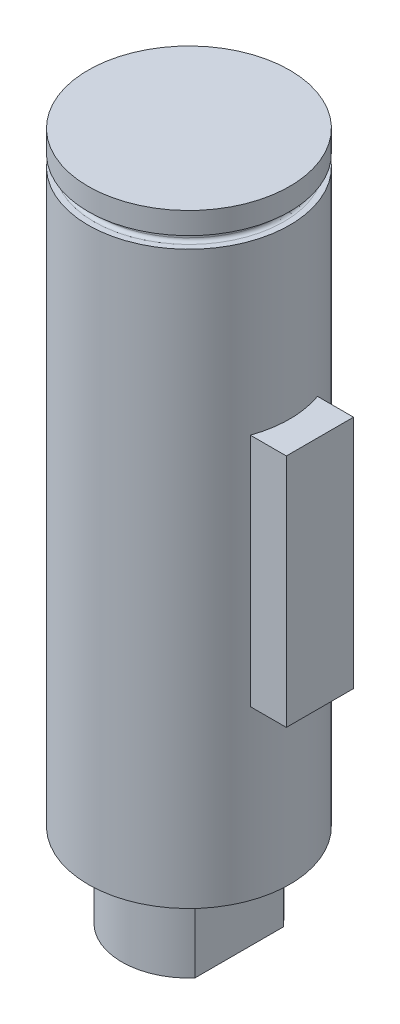
ISO-10303-21;
HEADER;
FILE_DESCRIPTION(('STEP AP214'),'2;1');
FILE_NAME('part.step','',(''),(''),'','','');
FILE_SCHEMA(('AUTOMOTIVE_DESIGN { 1 0 10303 214 1 1 1 1 }'));
ENDSEC;
DATA;
#1=APPLICATION_CONTEXT('core data for automotive mechanical design processes');
#2=APPLICATION_PROTOCOL_DEFINITION('international standard','automotive_design',2000,#1);
#3=PRODUCT_CONTEXT('',#1,'mechanical');
#4=PRODUCT('Part','Part','',(#3));
#5=PRODUCT_RELATED_PRODUCT_CATEGORY('part','',(#4));
#6=PRODUCT_DEFINITION_FORMATION('','',#4);
#7=PRODUCT_DEFINITION_CONTEXT('part definition',#1,'design');
#8=PRODUCT_DEFINITION('design','',#6,#7);
#9=PRODUCT_DEFINITION_SHAPE('','',#8);
#10=(LENGTH_UNIT() NAMED_UNIT(*) SI_UNIT(.MILLI.,.METRE.));
#11=(NAMED_UNIT(*) PLANE_ANGLE_UNIT() SI_UNIT($,.RADIAN.));
#12=(NAMED_UNIT(*) SI_UNIT($,.STERADIAN.) SOLID_ANGLE_UNIT());
#13=UNCERTAINTY_MEASURE_WITH_UNIT(LENGTH_MEASURE(1.E-05),#10,'distance_accuracy_value','');
#14=(GEOMETRIC_REPRESENTATION_CONTEXT(3) GLOBAL_UNCERTAINTY_ASSIGNED_CONTEXT((#13)) GLOBAL_UNIT_ASSIGNED_CONTEXT((#10,
#11,#12)) REPRESENTATION_CONTEXT('',''));
#15=CARTESIAN_POINT('',(0.,0.,0.));
#16=DIRECTION('',(0.,0.,1.));
#17=DIRECTION('',(1.,0.,0.));
#18=AXIS2_PLACEMENT_3D('',#15,#16,#17);
#19=CARTESIAN_POINT('',(0.,-10.,0.));
#20=DIRECTION('',(0.,-1.,0.));
#21=DIRECTION('',(0.,0.,-1.));
#22=AXIS2_PLACEMENT_3D('',#19,#20,#21);
#23=PLANE('',#22);
#24=CARTESIAN_POINT('',(0.,-10.,0.));
#25=DIRECTION('',(0.,-1.,0.));
#26=DIRECTION('',(0.,0.,-1.));
#27=AXIS2_PLACEMENT_3D('',#24,#25,#26);
#28=CIRCLE('',#27,6.);
#29=CARTESIAN_POINT('',(0.,-10.,-6.));
#30=VERTEX_POINT('',#29);
#31=EDGE_CURVE('E139',#30,#30,#28,.T.);
#32=ORIENTED_EDGE('',*,*,#31,.T.);
#33=EDGE_LOOP('',(#32));
#34=FACE_BOUND('',#33,.T.);
#35=DIRECTION('',(0.,0.,1.));
#36=VECTOR('',#35,1.);
#37=CARTESIAN_POINT('',(3.,-10.,-2.64575131106459));
#38=LINE('',#37,#36);
#39=CARTESIAN_POINT('',(3.,-10.,-2.64575131106459));
#40=VERTEX_POINT('',#39);
#41=CARTESIAN_POINT('',(3.,-10.,2.64575131106459));
#42=VERTEX_POINT('',#41);
#43=EDGE_CURVE('E115',#40,#42,#38,.T.);
#44=ORIENTED_EDGE('',*,*,#43,.F.);
#45=CARTESIAN_POINT('',(0.,-10.,0.));
#46=DIRECTION('',(0.,-1.,0.));
#47=DIRECTION('',(0.,0.,-1.));
#48=AXIS2_PLACEMENT_3D('',#45,#46,#47);
#49=CIRCLE('',#48,4.);
#50=EDGE_CURVE('E54',#42,#40,#49,.T.);
#51=ORIENTED_EDGE('',*,*,#50,.F.);
#52=EDGE_LOOP('',(#44,#51));
#53=FACE_BOUND('',#52,.T.);
#54=ADVANCED_FACE('F37',(#34,#53),#23,.T.);
#55=CARTESIAN_POINT('',(0.,14.,0.));
#56=DIRECTION('',(0.,-1.,0.));
#57=DIRECTION('',(0.,0.,-1.));
#58=AXIS2_PLACEMENT_3D('',#55,#56,#57);
#59=CYLINDRICAL_SURFACE('',#58,6.);
#60=ORIENTED_EDGE('',*,*,#31,.F.);
#61=EDGE_LOOP('',(#60));
#62=FACE_BOUND('',#61,.T.);
#63=DIRECTION('',(0.,-1.,0.));
#64=VECTOR('',#63,1.);
#65=CARTESIAN_POINT('',(5.65685424949238,14.,-2.));
#66=LINE('',#65,#64);
#67=CARTESIAN_POINT('',(5.65685424949238,14.,-2.));
#68=VERTEX_POINT('',#67);
#69=CARTESIAN_POINT('',(5.65685424949238,0.,-2.));
#70=VERTEX_POINT('',#69);
#71=EDGE_CURVE('E155',#68,#70,#66,.T.);
#72=ORIENTED_EDGE('',*,*,#71,.T.);
#73=CARTESIAN_POINT('',(0.,0.,0.));
#74=DIRECTION('',(0.,-1.,0.));
#75=DIRECTION('',(0.,0.,-1.));
#76=AXIS2_PLACEMENT_3D('',#73,#74,#75);
#77=CIRCLE('',#76,6.);
#78=CARTESIAN_POINT('',(5.65685424949238,0.,2.));
#79=VERTEX_POINT('',#78);
#80=EDGE_CURVE('E138',#70,#79,#77,.T.);
#81=ORIENTED_EDGE('',*,*,#80,.T.);
#82=DIRECTION('',(0.,-1.,0.));
#83=VECTOR('',#82,1.);
#84=CARTESIAN_POINT('',(5.65685424949238,14.,2.));
#85=LINE('',#84,#83);
#86=CARTESIAN_POINT('',(5.65685424949238,14.,2.));
#87=VERTEX_POINT('',#86);
#88=EDGE_CURVE('E11',#87,#79,#85,.T.);
#89=ORIENTED_EDGE('',*,*,#88,.F.);
#90=CARTESIAN_POINT('',(0.,14.,0.));
#91=DIRECTION('',(0.,1.,0.));
#92=DIRECTION('',(0.,0.,1.));
#93=AXIS2_PLACEMENT_3D('',#90,#91,#92);
#94=CIRCLE('',#93,6.);
#95=EDGE_CURVE('E142',#87,#68,#94,.T.);
#96=ORIENTED_EDGE('',*,*,#95,.T.);
#97=EDGE_LOOP('',(#72,#81,#89,#96));
#98=FACE_BOUND('',#97,.T.);
#99=CARTESIAN_POINT('',(0.,24.,0.));
#100=DIRECTION('',(0.,1.,0.));
#101=DIRECTION('',(0.,0.,1.));
#102=AXIS2_PLACEMENT_3D('',#99,#100,#101);
#103=CIRCLE('',#102,6.);
#104=CARTESIAN_POINT('',(0.,24.,6.));
#105=VERTEX_POINT('',#104);
#106=EDGE_CURVE('E134',#105,#105,#103,.T.);
#107=ORIENTED_EDGE('',*,*,#106,.F.);
#108=EDGE_LOOP('',(#107));
#109=FACE_BOUND('',#108,.T.);
#110=ADVANCED_FACE('F175',(#62,#98,#109),#59,.T.);
#111=CARTESIAN_POINT('',(0.,0.,0.));
#112=DIRECTION('',(0.,1.,0.));
#113=DIRECTION('',(0.,0.,1.));
#114=AXIS2_PLACEMENT_3D('',#111,#112,#113);
#115=PLANE('',#114);
#116=ORIENTED_EDGE('',*,*,#80,.F.);
#117=DIRECTION('',(-1.,0.,0.));
#118=VECTOR('',#117,1.);
#119=CARTESIAN_POINT('',(7.8,0.,-2.));
#120=LINE('',#119,#118);
#121=CARTESIAN_POINT('',(7.8,0.,-2.));
#122=VERTEX_POINT('',#121);
#123=EDGE_CURVE('E152',#122,#70,#120,.T.);
#124=ORIENTED_EDGE('',*,*,#123,.F.);
#125=DIRECTION('',(0.,0.,-1.));
#126=VECTOR('',#125,1.);
#127=CARTESIAN_POINT('',(7.8,0.,2.));
#128=LINE('',#127,#126);
#129=CARTESIAN_POINT('',(7.8,0.,2.));
#130=VERTEX_POINT('',#129);
#131=EDGE_CURVE('E81',#130,#122,#128,.T.);
#132=ORIENTED_EDGE('',*,*,#131,.F.);
#133=DIRECTION('',(1.,0.,0.));
#134=VECTOR('',#133,1.);
#135=CARTESIAN_POINT('',(7.8,0.,2.));
#136=LINE('',#135,#134);
#137=EDGE_CURVE('E147',#79,#130,#136,.T.);
#138=ORIENTED_EDGE('',*,*,#137,.F.);
#139=EDGE_LOOP('',(#116,#124,#132,#138));
#140=FACE_BOUND('',#139,.T.);
#141=ADVANCED_FACE('F186',(#140),#115,.F.);
#142=CARTESIAN_POINT('',(7.8,14.,2.));
#143=DIRECTION('',(0.,0.,-1.));
#144=DIRECTION('',(-1.,0.,0.));
#145=AXIS2_PLACEMENT_3D('',#142,#143,#144);
#146=PLANE('',#145);
#147=ORIENTED_EDGE('',*,*,#137,.T.);
#148=DIRECTION('',(0.,-1.,0.));
#149=VECTOR('',#148,1.);
#150=CARTESIAN_POINT('',(7.8,14.,2.));
#151=LINE('',#150,#149);
#152=CARTESIAN_POINT('',(7.8,14.,2.));
#153=VERTEX_POINT('',#152);
#154=EDGE_CURVE('E46',#153,#130,#151,.T.);
#155=ORIENTED_EDGE('',*,*,#154,.F.);
#156=DIRECTION('',(1.,0.,0.));
#157=VECTOR('',#156,1.);
#158=CARTESIAN_POINT('',(7.8,14.,2.));
#159=LINE('',#158,#157);
#160=EDGE_CURVE('E85',#87,#153,#159,.T.);
#161=ORIENTED_EDGE('',*,*,#160,.F.);
#162=ORIENTED_EDGE('',*,*,#88,.T.);
#163=EDGE_LOOP('',(#147,#155,#161,#162));
#164=FACE_BOUND('',#163,.T.);
#165=ADVANCED_FACE('F204',(#164),#146,.F.);
#166=CARTESIAN_POINT('',(7.8,14.,2.));
#167=DIRECTION('',(-1.,0.,0.));
#168=DIRECTION('',(0.,0.,1.));
#169=AXIS2_PLACEMENT_3D('',#166,#167,#168);
#170=PLANE('',#169);
#171=ORIENTED_EDGE('',*,*,#131,.T.);
#172=DIRECTION('',(0.,-1.,0.));
#173=VECTOR('',#172,1.);
#174=CARTESIAN_POINT('',(7.8,14.,-2.));
#175=LINE('',#174,#173);
#176=CARTESIAN_POINT('',(7.8,14.,-2.));
#177=VERTEX_POINT('',#176);
#178=EDGE_CURVE('E162',#177,#122,#175,.T.);
#179=ORIENTED_EDGE('',*,*,#178,.F.);
#180=DIRECTION('',(0.,0.,-1.));
#181=VECTOR('',#180,1.);
#182=CARTESIAN_POINT('',(7.8,14.,2.));
#183=LINE('',#182,#181);
#184=EDGE_CURVE('E151',#153,#177,#183,.T.);
#185=ORIENTED_EDGE('',*,*,#184,.F.);
#186=ORIENTED_EDGE('',*,*,#154,.T.);
#187=EDGE_LOOP('',(#171,#179,#185,#186));
#188=FACE_BOUND('',#187,.T.);
#189=ADVANCED_FACE('F208',(#188),#170,.F.);
#190=CARTESIAN_POINT('',(7.8,14.,-2.));
#191=DIRECTION('',(0.,0.,1.));
#192=DIRECTION('',(1.,0.,0.));
#193=AXIS2_PLACEMENT_3D('',#190,#191,#192);
#194=PLANE('',#193);
#195=ORIENTED_EDGE('',*,*,#123,.T.);
#196=ORIENTED_EDGE('',*,*,#71,.F.);
#197=DIRECTION('',(-1.,0.,0.));
#198=VECTOR('',#197,1.);
#199=CARTESIAN_POINT('',(7.8,14.,-2.));
#200=LINE('',#199,#198);
#201=EDGE_CURVE('E63',#177,#68,#200,.T.);
#202=ORIENTED_EDGE('',*,*,#201,.F.);
#203=ORIENTED_EDGE('',*,*,#178,.T.);
#204=EDGE_LOOP('',(#195,#196,#202,#203));
#205=FACE_BOUND('',#204,.T.);
#206=ADVANCED_FACE('F201',(#205),#194,.F.);
#207=CARTESIAN_POINT('',(0.,14.,0.));
#208=DIRECTION('',(0.,1.,0.));
#209=DIRECTION('',(0.,0.,1.));
#210=AXIS2_PLACEMENT_3D('',#207,#208,#209);
#211=PLANE('',#210);
#212=ORIENTED_EDGE('',*,*,#95,.F.);
#213=ORIENTED_EDGE('',*,*,#160,.T.);
#214=ORIENTED_EDGE('',*,*,#184,.T.);
#215=ORIENTED_EDGE('',*,*,#201,.T.);
#216=EDGE_LOOP('',(#212,#213,#214,#215));
#217=FACE_BOUND('',#216,.T.);
#218=ADVANCED_FACE('F198',(#217),#211,.T.);
#219=CARTESIAN_POINT('',(-5.5030110244233,24.7,-1.28037871939337));
#220=DIRECTION('',(0.,-1.,0.));
#221=DIRECTION('',(0.,0.,-1.));
#222=AXIS2_PLACEMENT_3D('',#219,#220,#221);
#223=PLANE('',#222);
#224=CARTESIAN_POINT('',(0.,24.7,0.));
#225=DIRECTION('',(0.,-1.,0.));
#226=DIRECTION('',(0.,0.,-1.));
#227=AXIS2_PLACEMENT_3D('',#224,#225,#226);
#228=CIRCLE('',#227,5.64999999999998);
#229=CARTESIAN_POINT('',(0.,24.7,-5.64999999999998));
#230=VERTEX_POINT('',#229);
#231=EDGE_CURVE('E131',#230,#230,#228,.T.);
#232=ORIENTED_EDGE('',*,*,#231,.F.);
#233=EDGE_LOOP('',(#232));
#234=FACE_BOUND('',#233,.T.);
#235=CARTESIAN_POINT('',(0.,24.7,0.));
#236=DIRECTION('',(0.,-1.,0.));
#237=DIRECTION('',(0.,0.,-1.));
#238=AXIS2_PLACEMENT_3D('',#235,#236,#237);
#239=CIRCLE('',#238,6.);
#240=CARTESIAN_POINT('',(0.,24.7,-6.));
#241=VERTEX_POINT('',#240);
#242=EDGE_CURVE('E41',#241,#241,#239,.T.);
#243=ORIENTED_EDGE('',*,*,#242,.T.);
#244=EDGE_LOOP('',(#243));
#245=FACE_BOUND('',#244,.T.);
#246=ADVANCED_FACE('F170',(#234,#245),#223,.T.);
#247=CARTESIAN_POINT('',(-6.98833700889154,24.,-1.6259676657783));
#248=DIRECTION('',(0.,1.,0.));
#249=DIRECTION('',(0.,0.,1.));
#250=AXIS2_PLACEMENT_3D('',#247,#248,#249);
#251=PLANE('',#250);
#252=CARTESIAN_POINT('',(0.,24.,0.));
#253=DIRECTION('',(0.,-1.,0.));
#254=DIRECTION('',(0.,0.,-1.));
#255=AXIS2_PLACEMENT_3D('',#252,#253,#254);
#256=CIRCLE('',#255,5.64999999999998);
#257=CARTESIAN_POINT('',(0.,24.,-5.64999999999998));
#258=VERTEX_POINT('',#257);
#259=EDGE_CURVE('E118',#258,#258,#256,.T.);
#260=ORIENTED_EDGE('',*,*,#259,.T.);
#261=EDGE_LOOP('',(#260));
#262=FACE_BOUND('',#261,.T.);
#263=ORIENTED_EDGE('',*,*,#106,.T.);
#264=EDGE_LOOP('',(#263));
#265=FACE_BOUND('',#264,.T.);
#266=ADVANCED_FACE('F242',(#262,#265),#251,.T.);
#267=CARTESIAN_POINT('',(0.,24.5,0.));
#268=DIRECTION('',(0.,-1.,0.));
#269=DIRECTION('',(0.,0.,-1.));
#270=AXIS2_PLACEMENT_3D('',#267,#268,#269);
#271=TOROIDAL_SURFACE('',#270,5.64999999999998,0.199999999999999);
#272=ORIENTED_EDGE('',*,*,#231,.T.);
#273=EDGE_LOOP('',(#272));
#274=FACE_BOUND('',#273,.T.);
#275=CARTESIAN_POINT('',(0.,24.5,0.));
#276=DIRECTION('',(0.,-1.,0.));
#277=DIRECTION('',(0.,0.,-1.));
#278=AXIS2_PLACEMENT_3D('',#275,#276,#277);
#279=CIRCLE('',#278,5.44999999999998);
#280=CARTESIAN_POINT('',(0.,24.5,-5.44999999999998));
#281=VERTEX_POINT('',#280);
#282=EDGE_CURVE('E128',#281,#281,#279,.T.);
#283=ORIENTED_EDGE('',*,*,#282,.F.);
#284=EDGE_LOOP('',(#283));
#285=FACE_BOUND('',#284,.T.);
#286=ADVANCED_FACE('F250',(#274,#285),#271,.F.);
#287=CARTESIAN_POINT('',(0.,60.2246155762171,0.));
#288=DIRECTION('',(0.,-1.,0.));
#289=DIRECTION('',(0.,0.,-1.));
#290=AXIS2_PLACEMENT_3D('',#287,#288,#289);
#291=CYLINDRICAL_SURFACE('',#290,5.44999999999998);
#292=ORIENTED_EDGE('',*,*,#282,.T.);
#293=EDGE_LOOP('',(#292));
#294=FACE_BOUND('',#293,.T.);
#295=CARTESIAN_POINT('',(0.,24.2,0.));
#296=DIRECTION('',(0.,-1.,0.));
#297=DIRECTION('',(0.,0.,-1.));
#298=AXIS2_PLACEMENT_3D('',#295,#296,#297);
#299=CIRCLE('',#298,5.44999999999998);
#300=CARTESIAN_POINT('',(0.,24.2,-5.44999999999998));
#301=VERTEX_POINT('',#300);
#302=EDGE_CURVE('E121',#301,#301,#299,.T.);
#303=ORIENTED_EDGE('',*,*,#302,.F.);
#304=EDGE_LOOP('',(#303));
#305=FACE_BOUND('',#304,.T.);
#306=ADVANCED_FACE('F258',(#294,#305),#291,.T.);
#307=CARTESIAN_POINT('',(0.,24.2,0.));
#308=DIRECTION('',(0.,-1.,0.));
#309=DIRECTION('',(0.,0.,-1.));
#310=AXIS2_PLACEMENT_3D('',#307,#308,#309);
#311=TOROIDAL_SURFACE('',#310,5.64999999999998,0.199999999999998);
#312=ORIENTED_EDGE('',*,*,#302,.T.);
#313=EDGE_LOOP('',(#312));
#314=FACE_BOUND('',#313,.T.);
#315=ORIENTED_EDGE('',*,*,#259,.F.);
#316=EDGE_LOOP('',(#315));
#317=FACE_BOUND('',#316,.T.);
#318=ADVANCED_FACE('F181',(#314,#317),#311,.F.);
#319=CARTESIAN_POINT('',(0.,26.,0.));
#320=DIRECTION('',(0.,1.,0.));
#321=DIRECTION('',(0.,0.,1.));
#322=AXIS2_PLACEMENT_3D('',#319,#320,#321);
#323=PLANE('',#322);
#324=CARTESIAN_POINT('',(0.,26.,0.));
#325=DIRECTION('',(0.,1.,0.));
#326=DIRECTION('',(0.,0.,1.));
#327=AXIS2_PLACEMENT_3D('',#324,#325,#326);
#328=CIRCLE('',#327,6.);
#329=CARTESIAN_POINT('',(0.,26.,6.));
#330=VERTEX_POINT('',#329);
#331=EDGE_CURVE('E144',#330,#330,#328,.T.);
#332=ORIENTED_EDGE('',*,*,#331,.T.);
#333=EDGE_LOOP('',(#332));
#334=FACE_BOUND('',#333,.T.);
#335=ADVANCED_FACE('F173',(#334),#323,.T.);
#336=ORIENTED_EDGE('',*,*,#331,.F.);
#337=EDGE_LOOP('',(#336));
#338=FACE_BOUND('',#337,.T.);
#339=ORIENTED_EDGE('',*,*,#242,.F.);
#340=EDGE_LOOP('',(#339));
#341=FACE_BOUND('',#340,.T.);
#342=ADVANCED_FACE('F39',(#338,#341),#59,.T.);
#343=CARTESIAN_POINT('',(0.,-15.,0.));
#344=DIRECTION('',(0.,-1.,0.));
#345=DIRECTION('',(0.,0.,-1.));
#346=AXIS2_PLACEMENT_3D('',#343,#344,#345);
#347=PLANE('',#346);
#348=CARTESIAN_POINT('',(0.,-15.,0.));
#349=DIRECTION('',(0.,-1.,0.));
#350=DIRECTION('',(0.,0.,-1.));
#351=AXIS2_PLACEMENT_3D('',#348,#349,#350);
#352=CIRCLE('',#351,4.);
#353=CARTESIAN_POINT('',(3.,-15.,2.64575131106459));
#354=VERTEX_POINT('',#353);
#355=CARTESIAN_POINT('',(3.,-15.,-2.64575131106459));
#356=VERTEX_POINT('',#355);
#357=EDGE_CURVE('E111',#354,#356,#352,.T.);
#358=ORIENTED_EDGE('',*,*,#357,.T.);
#359=DIRECTION('',(0.,0.,1.));
#360=VECTOR('',#359,1.);
#361=CARTESIAN_POINT('',(3.,-15.,-2.64575131106459));
#362=LINE('',#361,#360);
#363=EDGE_CURVE('E103',#356,#354,#362,.T.);
#364=ORIENTED_EDGE('',*,*,#363,.T.);
#365=EDGE_LOOP('',(#358,#364));
#366=FACE_BOUND('',#365,.T.);
#367=CARTESIAN_POINT('',(0.,-15.,0.));
#368=DIRECTION('',(0.,-1.,0.));
#369=DIRECTION('',(0.,0.,-1.));
#370=AXIS2_PLACEMENT_3D('',#367,#368,#369);
#371=CIRCLE('',#370,1.5);
#372=CARTESIAN_POINT('',(0.,-15.,-1.5));
#373=VERTEX_POINT('',#372);
#374=EDGE_CURVE('E377',#373,#373,#371,.T.);
#375=ORIENTED_EDGE('',*,*,#374,.F.);
#376=EDGE_LOOP('',(#375));
#377=FACE_BOUND('',#376,.T.);
#378=ADVANCED_FACE('F113',(#366,#377),#347,.T.);
#379=CARTESIAN_POINT('',(0.,-15.,0.));
#380=DIRECTION('',(0.,1.,0.));
#381=DIRECTION('',(0.,0.,1.));
#382=AXIS2_PLACEMENT_3D('',#379,#380,#381);
#383=CYLINDRICAL_SURFACE('',#382,4.);
#384=ORIENTED_EDGE('',*,*,#50,.T.);
#385=DIRECTION('',(0.,1.,0.));
#386=VECTOR('',#385,1.);
#387=CARTESIAN_POINT('',(3.,-15.,-2.64575131106459));
#388=LINE('',#387,#386);
#389=EDGE_CURVE('E106',#356,#40,#388,.T.);
#390=ORIENTED_EDGE('',*,*,#389,.F.);
#391=ORIENTED_EDGE('',*,*,#357,.F.);
#392=DIRECTION('',(0.,1.,0.));
#393=VECTOR('',#392,1.);
#394=CARTESIAN_POINT('',(3.,-15.,2.64575131106459));
#395=LINE('',#394,#393);
#396=EDGE_CURVE('E108',#354,#42,#395,.T.);
#397=ORIENTED_EDGE('',*,*,#396,.T.);
#398=EDGE_LOOP('',(#384,#390,#391,#397));
#399=FACE_BOUND('',#398,.T.);
#400=ADVANCED_FACE('F117',(#399),#383,.T.);
#401=CARTESIAN_POINT('',(3.,-15.,-2.64575131106459));
#402=DIRECTION('',(-1.,0.,0.));
#403=DIRECTION('',(0.,0.,1.));
#404=AXIS2_PLACEMENT_3D('',#401,#402,#403);
#405=PLANE('',#404);
#406=ORIENTED_EDGE('',*,*,#43,.T.);
#407=ORIENTED_EDGE('',*,*,#396,.F.);
#408=ORIENTED_EDGE('',*,*,#363,.F.);
#409=ORIENTED_EDGE('',*,*,#389,.T.);
#410=EDGE_LOOP('',(#406,#407,#408,#409));
#411=FACE_BOUND('',#410,.T.);
#412=ADVANCED_FACE('F105',(#411),#405,.F.);
#413=CARTESIAN_POINT('',(0.,-5.,0.));
#414=DIRECTION('',(0.,-1.,0.));
#415=DIRECTION('',(0.,0.,-1.));
#416=AXIS2_PLACEMENT_3D('',#413,#414,#415);
#417=PLANE('',#416);
#418=CARTESIAN_POINT('',(0.,-5.,0.));
#419=DIRECTION('',(0.,-1.,0.));
#420=DIRECTION('',(0.,0.,-1.));
#421=AXIS2_PLACEMENT_3D('',#418,#419,#420);
#422=CIRCLE('',#421,1.5);
#423=CARTESIAN_POINT('',(0.,-5.,-1.5));
#424=VERTEX_POINT('',#423);
#425=EDGE_CURVE('E135',#424,#424,#422,.T.);
#426=ORIENTED_EDGE('',*,*,#425,.T.);
#427=EDGE_LOOP('',(#426));
#428=FACE_BOUND('',#427,.T.);
#429=ADVANCED_FACE('F292',(#428),#417,.T.);
#430=CARTESIAN_POINT('',(0.,-5.,0.));
#431=DIRECTION('',(0.,-1.,0.));
#432=DIRECTION('',(0.,0.,-1.));
#433=AXIS2_PLACEMENT_3D('',#430,#431,#432);
#434=CYLINDRICAL_SURFACE('',#433,1.5);
#435=ORIENTED_EDGE('',*,*,#425,.F.);
#436=EDGE_LOOP('',(#435));
#437=FACE_BOUND('',#436,.T.);
#438=ORIENTED_EDGE('',*,*,#374,.T.);
#439=EDGE_LOOP('',(#438));
#440=FACE_BOUND('',#439,.T.);
#441=ADVANCED_FACE('F195',(#437,#440),#434,.F.);
#442=CLOSED_SHELL('',(#54,#110,#141,#165,#189,#206,#218,#246,#266,#286,#306,#318,#335,#342,#378,
#400,#412,#429,#441));
#443=MANIFOLD_SOLID_BREP('B2',#442);
#444=ADVANCED_BREP_SHAPE_REPRESENTATION('',(#18,#443),#14);
#445=SHAPE_DEFINITION_REPRESENTATION(#9,#444);
ENDSEC;
END-ISO-10303-21;
